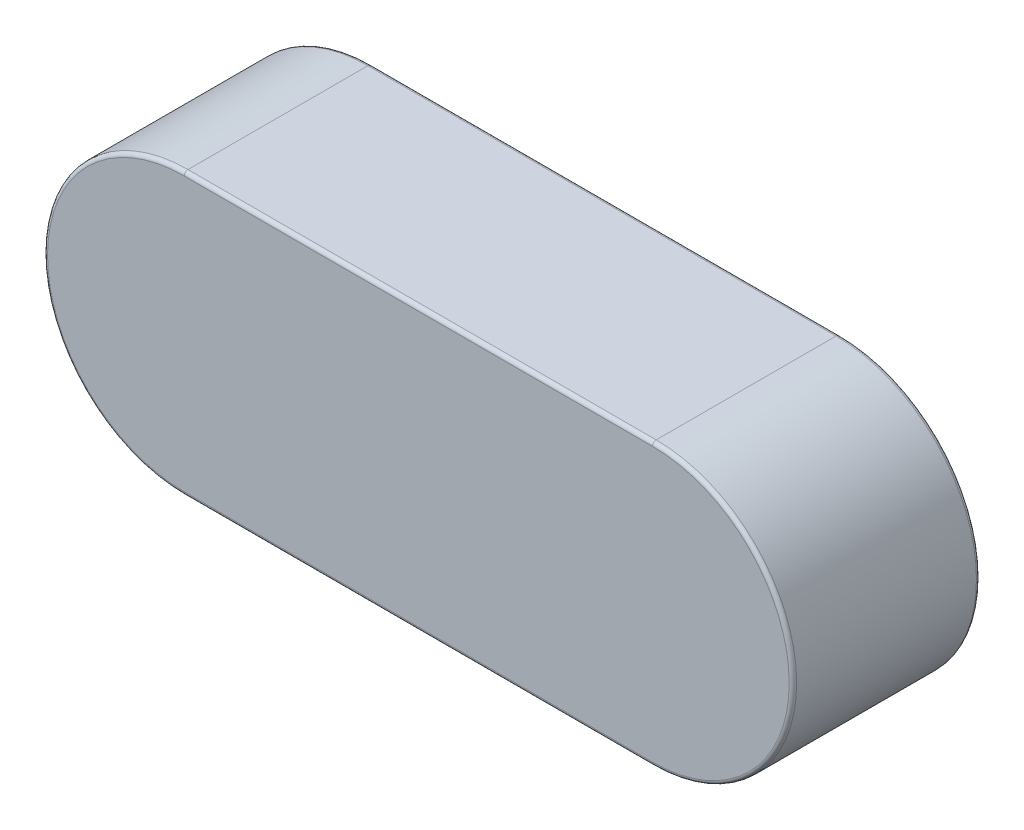
ISO-10303-21;
HEADER;
FILE_DESCRIPTION(('STEP AP214'),'2;1');
FILE_NAME('part.step','',(''),(''),'','','');
FILE_SCHEMA(('AUTOMOTIVE_DESIGN { 1 0 10303 214 1 1 1 1 }'));
ENDSEC;
DATA;
#1=APPLICATION_CONTEXT('core data for automotive mechanical design processes');
#2=APPLICATION_PROTOCOL_DEFINITION('international standard','automotive_design',2000,#1);
#3=PRODUCT_CONTEXT('',#1,'mechanical');
#4=PRODUCT('Part','Part','',(#3));
#5=PRODUCT_RELATED_PRODUCT_CATEGORY('part','',(#4));
#6=PRODUCT_DEFINITION_FORMATION('','',#4);
#7=PRODUCT_DEFINITION_CONTEXT('part definition',#1,'design');
#8=PRODUCT_DEFINITION('design','',#6,#7);
#9=PRODUCT_DEFINITION_SHAPE('','',#8);
#10=(LENGTH_UNIT() NAMED_UNIT(*) SI_UNIT(.MILLI.,.METRE.));
#11=(NAMED_UNIT(*) PLANE_ANGLE_UNIT() SI_UNIT($,.RADIAN.));
#12=(NAMED_UNIT(*) SI_UNIT($,.STERADIAN.) SOLID_ANGLE_UNIT());
#13=UNCERTAINTY_MEASURE_WITH_UNIT(LENGTH_MEASURE(1.E-05),#10,'distance_accuracy_value','');
#14=(GEOMETRIC_REPRESENTATION_CONTEXT(3) GLOBAL_UNCERTAINTY_ASSIGNED_CONTEXT((#13)) GLOBAL_UNIT_ASSIGNED_CONTEXT((#10,
#11,#12)) REPRESENTATION_CONTEXT('',''));
#15=CARTESIAN_POINT('',(0.,0.,0.));
#16=DIRECTION('',(0.,0.,1.));
#17=DIRECTION('',(1.,0.,0.));
#18=AXIS2_PLACEMENT_3D('',#15,#16,#17);
#19=CARTESIAN_POINT('',(0.,0.,8.));
#20=DIRECTION('',(0.,0.,-1.));
#21=DIRECTION('',(-1.,0.,0.));
#22=AXIS2_PLACEMENT_3D('',#19,#20,#21);
#23=CYLINDRICAL_SURFACE('',#22,6.);
#24=DIRECTION('',(0.,0.,-1.));
#25=VECTOR('',#24,1.);
#26=CARTESIAN_POINT('',(0.,-6.,8.));
#27=LINE('',#26,#25);
#28=CARTESIAN_POINT('',(0.,-6.,7.84));
#29=VERTEX_POINT('',#28);
#30=CARTESIAN_POINT('',(0.,-6.,0.16));
#31=VERTEX_POINT('',#30);
#32=EDGE_CURVE('E133',#29,#31,#27,.T.);
#33=ORIENTED_EDGE('',*,*,#32,.F.);
#34=CARTESIAN_POINT('',(0.,0.,7.84));
#35=DIRECTION('',(0.,0.,1.));
#36=DIRECTION('',(1.,0.,0.));
#37=AXIS2_PLACEMENT_3D('',#34,#35,#36);
#38=CIRCLE('',#37,6.);
#39=CARTESIAN_POINT('',(0.,6.,7.84));
#40=VERTEX_POINT('',#39);
#41=EDGE_CURVE('E166',#29,#40,#38,.F.);
#42=ORIENTED_EDGE('',*,*,#41,.T.);
#43=DIRECTION('',(0.,0.,-1.));
#44=VECTOR('',#43,1.);
#45=CARTESIAN_POINT('',(0.,6.,8.));
#46=LINE('',#45,#44);
#47=CARTESIAN_POINT('',(0.,6.,0.16));
#48=VERTEX_POINT('',#47);
#49=EDGE_CURVE('E184',#40,#48,#46,.T.);
#50=ORIENTED_EDGE('',*,*,#49,.T.);
#51=CARTESIAN_POINT('',(0.,0.,0.16));
#52=DIRECTION('',(0.,0.,1.));
#53=DIRECTION('',(1.,0.,0.));
#54=AXIS2_PLACEMENT_3D('',#51,#52,#53);
#55=CIRCLE('',#54,6.);
#56=EDGE_CURVE('E163',#48,#31,#55,.T.);
#57=ORIENTED_EDGE('',*,*,#56,.T.);
#58=EDGE_LOOP('',(#33,#42,#50,#57));
#59=FACE_BOUND('',#58,.T.);
#60=ADVANCED_FACE('F45',(#59),#23,.T.);
#61=CARTESIAN_POINT('',(0.,-6.,8.));
#62=DIRECTION('',(0.,1.,0.));
#63=DIRECTION('',(0.,0.,1.));
#64=AXIS2_PLACEMENT_3D('',#61,#62,#63);
#65=PLANE('',#64);
#66=DIRECTION('',(0.,0.,-1.));
#67=VECTOR('',#66,1.);
#68=CARTESIAN_POINT('',(20.,-6.,8.));
#69=LINE('',#68,#67);
#70=CARTESIAN_POINT('',(20.,-6.,7.84));
#71=VERTEX_POINT('',#70);
#72=CARTESIAN_POINT('',(20.,-6.,0.16));
#73=VERTEX_POINT('',#72);
#74=EDGE_CURVE('E320',#71,#73,#69,.T.);
#75=ORIENTED_EDGE('',*,*,#74,.F.);
#76=DIRECTION('',(1.,0.,0.));
#77=VECTOR('',#76,1.);
#78=CARTESIAN_POINT('',(0.,-6.,7.84));
#79=LINE('',#78,#77);
#80=EDGE_CURVE('E160',#71,#29,#79,.F.);
#81=ORIENTED_EDGE('',*,*,#80,.T.);
#82=ORIENTED_EDGE('',*,*,#32,.T.);
#83=DIRECTION('',(1.,0.,0.));
#84=VECTOR('',#83,1.);
#85=CARTESIAN_POINT('',(0.,-6.,0.16));
#86=LINE('',#85,#84);
#87=EDGE_CURVE('E156',#31,#73,#86,.T.);
#88=ORIENTED_EDGE('',*,*,#87,.T.);
#89=EDGE_LOOP('',(#75,#81,#82,#88));
#90=FACE_BOUND('',#89,.T.);
#91=ADVANCED_FACE('F225',(#90),#65,.F.);
#92=CARTESIAN_POINT('',(20.,0.,8.));
#93=DIRECTION('',(0.,0.,-1.));
#94=DIRECTION('',(-1.,0.,0.));
#95=AXIS2_PLACEMENT_3D('',#92,#93,#94);
#96=CYLINDRICAL_SURFACE('',#95,6.);
#97=DIRECTION('',(0.,0.,-1.));
#98=VECTOR('',#97,1.);
#99=CARTESIAN_POINT('',(20.,6.,8.));
#100=LINE('',#99,#98);
#101=CARTESIAN_POINT('',(20.,6.,7.84));
#102=VERTEX_POINT('',#101);
#103=CARTESIAN_POINT('',(20.,6.,0.16));
#104=VERTEX_POINT('',#103);
#105=EDGE_CURVE('E315',#102,#104,#100,.T.);
#106=ORIENTED_EDGE('',*,*,#105,.F.);
#107=CARTESIAN_POINT('',(20.,0.,7.84));
#108=DIRECTION('',(0.,0.,1.));
#109=DIRECTION('',(1.,0.,0.));
#110=AXIS2_PLACEMENT_3D('',#107,#108,#109);
#111=CIRCLE('',#110,6.);
#112=EDGE_CURVE('E153',#102,#71,#111,.F.);
#113=ORIENTED_EDGE('',*,*,#112,.T.);
#114=ORIENTED_EDGE('',*,*,#74,.T.);
#115=CARTESIAN_POINT('',(20.,0.,0.16));
#116=DIRECTION('',(0.,0.,1.));
#117=DIRECTION('',(1.,0.,0.));
#118=AXIS2_PLACEMENT_3D('',#115,#116,#117);
#119=CIRCLE('',#118,6.);
#120=EDGE_CURVE('E150',#73,#104,#119,.T.);
#121=ORIENTED_EDGE('',*,*,#120,.T.);
#122=EDGE_LOOP('',(#106,#113,#114,#121));
#123=FACE_BOUND('',#122,.T.);
#124=ADVANCED_FACE('F231',(#123),#96,.T.);
#125=CARTESIAN_POINT('',(0.,6.,8.));
#126=DIRECTION('',(0.,-1.,0.));
#127=DIRECTION('',(0.,0.,-1.));
#128=AXIS2_PLACEMENT_3D('',#125,#126,#127);
#129=PLANE('',#128);
#130=ORIENTED_EDGE('',*,*,#49,.F.);
#131=DIRECTION('',(-1.,0.,0.));
#132=VECTOR('',#131,1.);
#133=CARTESIAN_POINT('',(20.,6.,7.84));
#134=LINE('',#133,#132);
#135=EDGE_CURVE('E118',#40,#102,#134,.F.);
#136=ORIENTED_EDGE('',*,*,#135,.T.);
#137=ORIENTED_EDGE('',*,*,#105,.T.);
#138=DIRECTION('',(-1.,0.,0.));
#139=VECTOR('',#138,1.);
#140=CARTESIAN_POINT('',(0.,6.,0.16));
#141=LINE('',#140,#139);
#142=EDGE_CURVE('E140',#104,#48,#141,.T.);
#143=ORIENTED_EDGE('',*,*,#142,.T.);
#144=EDGE_LOOP('',(#130,#136,#137,#143));
#145=FACE_BOUND('',#144,.T.);
#146=ADVANCED_FACE('F221',(#145),#129,.F.);
#147=CARTESIAN_POINT('',(0.,0.,8.));
#148=DIRECTION('',(0.,0.,1.));
#149=DIRECTION('',(1.,0.,0.));
#150=AXIS2_PLACEMENT_3D('',#147,#148,#149);
#151=PLANE('',#150);
#152=CARTESIAN_POINT('',(20.,0.,8.));
#153=DIRECTION('',(0.,0.,1.));
#154=DIRECTION('',(1.,0.,0.));
#155=AXIS2_PLACEMENT_3D('',#152,#153,#154);
#156=CIRCLE('',#155,5.84);
#157=CARTESIAN_POINT('',(20.,-5.84,8.));
#158=VERTEX_POINT('',#157);
#159=CARTESIAN_POINT('',(20.,5.84,8.));
#160=VERTEX_POINT('',#159);
#161=EDGE_CURVE('E137',#158,#160,#156,.T.);
#162=ORIENTED_EDGE('',*,*,#161,.T.);
#163=DIRECTION('',(-1.,0.,0.));
#164=VECTOR('',#163,1.);
#165=CARTESIAN_POINT('',(0.,5.84,8.));
#166=LINE('',#165,#164);
#167=CARTESIAN_POINT('',(0.,5.84,8.));
#168=VERTEX_POINT('',#167);
#169=EDGE_CURVE('E116',#160,#168,#166,.T.);
#170=ORIENTED_EDGE('',*,*,#169,.T.);
#171=CARTESIAN_POINT('',(0.,0.,8.));
#172=DIRECTION('',(0.,0.,1.));
#173=DIRECTION('',(1.,0.,0.));
#174=AXIS2_PLACEMENT_3D('',#171,#172,#173);
#175=CIRCLE('',#174,5.84);
#176=CARTESIAN_POINT('',(0.,-5.84,8.));
#177=VERTEX_POINT('',#176);
#178=EDGE_CURVE('E125',#168,#177,#175,.T.);
#179=ORIENTED_EDGE('',*,*,#178,.T.);
#180=DIRECTION('',(1.,0.,0.));
#181=VECTOR('',#180,1.);
#182=CARTESIAN_POINT('',(20.,-5.84,8.));
#183=LINE('',#182,#181);
#184=EDGE_CURVE('E132',#177,#158,#183,.T.);
#185=ORIENTED_EDGE('',*,*,#184,.T.);
#186=EDGE_LOOP('',(#162,#170,#179,#185));
#187=FACE_BOUND('',#186,.T.);
#188=ADVANCED_FACE('F135',(#187),#151,.T.);
#189=CARTESIAN_POINT('',(0.,0.,0.));
#190=DIRECTION('',(0.,0.,1.));
#191=DIRECTION('',(1.,0.,0.));
#192=AXIS2_PLACEMENT_3D('',#189,#190,#191);
#193=PLANE('',#192);
#194=CARTESIAN_POINT('',(20.,0.,0.));
#195=DIRECTION('',(0.,0.,1.));
#196=DIRECTION('',(1.,0.,0.));
#197=AXIS2_PLACEMENT_3D('',#194,#195,#196);
#198=CIRCLE('',#197,5.84);
#199=CARTESIAN_POINT('',(20.,5.84,0.));
#200=VERTEX_POINT('',#199);
#201=CARTESIAN_POINT('',(20.,-5.84,0.));
#202=VERTEX_POINT('',#201);
#203=EDGE_CURVE('E55',#200,#202,#198,.F.);
#204=ORIENTED_EDGE('',*,*,#203,.T.);
#205=DIRECTION('',(1.,0.,0.));
#206=VECTOR('',#205,1.);
#207=CARTESIAN_POINT('',(0.,-5.84,0.));
#208=LINE('',#207,#206);
#209=CARTESIAN_POINT('',(0.,-5.84,0.));
#210=VERTEX_POINT('',#209);
#211=EDGE_CURVE('E11',#202,#210,#208,.F.);
#212=ORIENTED_EDGE('',*,*,#211,.T.);
#213=CARTESIAN_POINT('',(0.,0.,0.));
#214=DIRECTION('',(0.,0.,1.));
#215=DIRECTION('',(1.,0.,0.));
#216=AXIS2_PLACEMENT_3D('',#213,#214,#215);
#217=CIRCLE('',#216,5.84);
#218=CARTESIAN_POINT('',(0.,5.84,0.));
#219=VERTEX_POINT('',#218);
#220=EDGE_CURVE('E169',#210,#219,#217,.F.);
#221=ORIENTED_EDGE('',*,*,#220,.T.);
#222=DIRECTION('',(-1.,0.,0.));
#223=VECTOR('',#222,1.);
#224=CARTESIAN_POINT('',(0.,5.84,0.));
#225=LINE('',#224,#223);
#226=EDGE_CURVE('E66',#219,#200,#225,.F.);
#227=ORIENTED_EDGE('',*,*,#226,.T.);
#228=EDGE_LOOP('',(#204,#212,#221,#227));
#229=FACE_BOUND('',#228,.T.);
#230=ADVANCED_FACE('F210',(#229),#193,.F.);
#231=CARTESIAN_POINT('',(0.,-5.84,7.84));
#232=DIRECTION('',(-1.,0.,0.));
#233=DIRECTION('',(0.,0.,1.));
#234=AXIS2_PLACEMENT_3D('',#231,#232,#233);
#235=CYLINDRICAL_SURFACE('',#234,0.16);
#236=CARTESIAN_POINT('',(0.,-5.84,7.84));
#237=DIRECTION('',(-1.,0.,0.));
#238=DIRECTION('',(0.,0.,1.));
#239=AXIS2_PLACEMENT_3D('',#236,#237,#238);
#240=CIRCLE('',#239,0.16);
#241=EDGE_CURVE('E128',#29,#177,#240,.T.);
#242=ORIENTED_EDGE('',*,*,#241,.F.);
#243=ORIENTED_EDGE('',*,*,#80,.F.);
#244=CARTESIAN_POINT('',(20.,-5.84,7.84));
#245=DIRECTION('',(1.,0.,0.));
#246=DIRECTION('',(0.,0.,-1.));
#247=AXIS2_PLACEMENT_3D('',#244,#245,#246);
#248=CIRCLE('',#247,0.16);
#249=EDGE_CURVE('E180',#158,#71,#248,.T.);
#250=ORIENTED_EDGE('',*,*,#249,.F.);
#251=ORIENTED_EDGE('',*,*,#184,.F.);
#252=EDGE_LOOP('',(#242,#243,#250,#251));
#253=FACE_BOUND('',#252,.T.);
#254=ADVANCED_FACE('F212',(#253),#235,.T.);
#255=CARTESIAN_POINT('',(20.,0.,7.84));
#256=DIRECTION('',(0.,0.,1.));
#257=DIRECTION('',(1.,0.,0.));
#258=AXIS2_PLACEMENT_3D('',#255,#256,#257);
#259=TOROIDAL_SURFACE('',#258,5.84,0.16);
#260=ORIENTED_EDGE('',*,*,#249,.T.);
#261=ORIENTED_EDGE('',*,*,#112,.F.);
#262=CARTESIAN_POINT('',(20.,5.84,7.84));
#263=DIRECTION('',(-1.,0.,0.));
#264=DIRECTION('',(0.,0.,1.));
#265=AXIS2_PLACEMENT_3D('',#262,#263,#264);
#266=CIRCLE('',#265,0.16);
#267=EDGE_CURVE('E122',#160,#102,#266,.T.);
#268=ORIENTED_EDGE('',*,*,#267,.F.);
#269=ORIENTED_EDGE('',*,*,#161,.F.);
#270=EDGE_LOOP('',(#260,#261,#268,#269));
#271=FACE_BOUND('',#270,.T.);
#272=ADVANCED_FACE('F218',(#271),#259,.T.);
#273=CARTESIAN_POINT('',(0.,0.,7.84));
#274=DIRECTION('',(0.,0.,1.));
#275=DIRECTION('',(1.,0.,0.));
#276=AXIS2_PLACEMENT_3D('',#273,#274,#275);
#277=TOROIDAL_SURFACE('',#276,5.84,0.16);
#278=ORIENTED_EDGE('',*,*,#241,.T.);
#279=ORIENTED_EDGE('',*,*,#178,.F.);
#280=CARTESIAN_POINT('',(0.,5.84,7.84));
#281=DIRECTION('',(1.,0.,0.));
#282=DIRECTION('',(0.,0.,-1.));
#283=AXIS2_PLACEMENT_3D('',#280,#281,#282);
#284=CIRCLE('',#283,0.16);
#285=EDGE_CURVE('E112',#40,#168,#284,.T.);
#286=ORIENTED_EDGE('',*,*,#285,.F.);
#287=ORIENTED_EDGE('',*,*,#41,.F.);
#288=EDGE_LOOP('',(#278,#279,#286,#287));
#289=FACE_BOUND('',#288,.T.);
#290=ADVANCED_FACE('F126',(#289),#277,.T.);
#291=CARTESIAN_POINT('',(0.,5.84,7.84));
#292=DIRECTION('',(1.,0.,0.));
#293=DIRECTION('',(0.,0.,-1.));
#294=AXIS2_PLACEMENT_3D('',#291,#292,#293);
#295=CYLINDRICAL_SURFACE('',#294,0.16);
#296=ORIENTED_EDGE('',*,*,#267,.T.);
#297=ORIENTED_EDGE('',*,*,#135,.F.);
#298=ORIENTED_EDGE('',*,*,#285,.T.);
#299=ORIENTED_EDGE('',*,*,#169,.F.);
#300=EDGE_LOOP('',(#296,#297,#298,#299));
#301=FACE_BOUND('',#300,.T.);
#302=ADVANCED_FACE('F114',(#301),#295,.T.);
#303=CARTESIAN_POINT('',(0.,5.84,0.16));
#304=DIRECTION('',(-1.,0.,0.));
#305=DIRECTION('',(0.,0.,1.));
#306=AXIS2_PLACEMENT_3D('',#303,#304,#305);
#307=CYLINDRICAL_SURFACE('',#306,0.16);
#308=CARTESIAN_POINT('',(20.,5.84,0.16));
#309=DIRECTION('',(1.,0.,0.));
#310=DIRECTION('',(0.,0.,-1.));
#311=AXIS2_PLACEMENT_3D('',#308,#309,#310);
#312=CIRCLE('',#311,0.16);
#313=EDGE_CURVE('E190',#200,#104,#312,.T.);
#314=ORIENTED_EDGE('',*,*,#313,.F.);
#315=ORIENTED_EDGE('',*,*,#226,.F.);
#316=CARTESIAN_POINT('',(0.,5.84,0.16));
#317=DIRECTION('',(-1.,0.,0.));
#318=DIRECTION('',(0.,0.,1.));
#319=AXIS2_PLACEMENT_3D('',#316,#317,#318);
#320=CIRCLE('',#319,0.16);
#321=EDGE_CURVE('E49',#48,#219,#320,.T.);
#322=ORIENTED_EDGE('',*,*,#321,.F.);
#323=ORIENTED_EDGE('',*,*,#142,.F.);
#324=EDGE_LOOP('',(#314,#315,#322,#323));
#325=FACE_BOUND('',#324,.T.);
#326=ADVANCED_FACE('F47',(#325),#307,.T.);
#327=CARTESIAN_POINT('',(0.,0.,0.16));
#328=DIRECTION('',(0.,0.,1.));
#329=DIRECTION('',(1.,0.,0.));
#330=AXIS2_PLACEMENT_3D('',#327,#328,#329);
#331=TOROIDAL_SURFACE('',#330,5.84,0.16);
#332=ORIENTED_EDGE('',*,*,#321,.T.);
#333=ORIENTED_EDGE('',*,*,#220,.F.);
#334=CARTESIAN_POINT('',(0.,-5.84,0.16));
#335=DIRECTION('',(1.,0.,0.));
#336=DIRECTION('',(0.,0.,-1.));
#337=AXIS2_PLACEMENT_3D('',#334,#335,#336);
#338=CIRCLE('',#337,0.16);
#339=EDGE_CURVE('E188',#31,#210,#338,.T.);
#340=ORIENTED_EDGE('',*,*,#339,.F.);
#341=ORIENTED_EDGE('',*,*,#56,.F.);
#342=EDGE_LOOP('',(#332,#333,#340,#341));
#343=FACE_BOUND('',#342,.T.);
#344=ADVANCED_FACE('F201',(#343),#331,.T.);
#345=CARTESIAN_POINT('',(20.,0.,0.16));
#346=DIRECTION('',(0.,0.,1.));
#347=DIRECTION('',(1.,0.,0.));
#348=AXIS2_PLACEMENT_3D('',#345,#346,#347);
#349=TOROIDAL_SURFACE('',#348,5.84,0.16);
#350=ORIENTED_EDGE('',*,*,#313,.T.);
#351=ORIENTED_EDGE('',*,*,#120,.F.);
#352=CARTESIAN_POINT('',(20.,-5.84,0.16));
#353=DIRECTION('',(-1.,0.,0.));
#354=DIRECTION('',(0.,0.,1.));
#355=AXIS2_PLACEMENT_3D('',#352,#353,#354);
#356=CIRCLE('',#355,0.16);
#357=EDGE_CURVE('E185',#202,#73,#356,.T.);
#358=ORIENTED_EDGE('',*,*,#357,.F.);
#359=ORIENTED_EDGE('',*,*,#203,.F.);
#360=EDGE_LOOP('',(#350,#351,#358,#359));
#361=FACE_BOUND('',#360,.T.);
#362=ADVANCED_FACE('F206',(#361),#349,.T.);
#363=CARTESIAN_POINT('',(0.,-5.84,0.16));
#364=DIRECTION('',(1.,0.,0.));
#365=DIRECTION('',(0.,0.,-1.));
#366=AXIS2_PLACEMENT_3D('',#363,#364,#365);
#367=CYLINDRICAL_SURFACE('',#366,0.16);
#368=ORIENTED_EDGE('',*,*,#339,.T.);
#369=ORIENTED_EDGE('',*,*,#211,.F.);
#370=ORIENTED_EDGE('',*,*,#357,.T.);
#371=ORIENTED_EDGE('',*,*,#87,.F.);
#372=EDGE_LOOP('',(#368,#369,#370,#371));
#373=FACE_BOUND('',#372,.T.);
#374=ADVANCED_FACE('F209',(#373),#367,.T.);
#375=CLOSED_SHELL('',(#60,#91,#124,#146,#188,#230,#254,#272,#290,#302,#326,#344,#362,#374));
#376=MANIFOLD_SOLID_BREP('B2',#375);
#377=ADVANCED_BREP_SHAPE_REPRESENTATION('',(#18,#376),#14);
#378=SHAPE_DEFINITION_REPRESENTATION(#9,#377);
ENDSEC;
END-ISO-10303-21;
